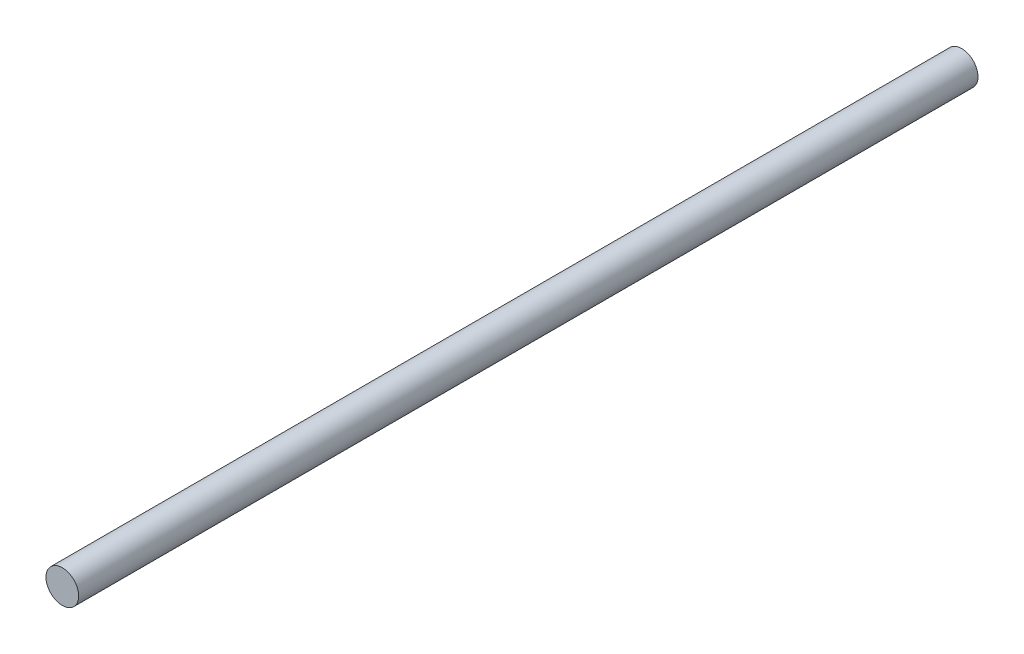
ISO-10303-21;
HEADER;
FILE_DESCRIPTION(('STEP AP214'),'2;1');
FILE_NAME('part.step','',(''),(''),'','','');
FILE_SCHEMA(('AUTOMOTIVE_DESIGN { 1 0 10303 214 1 1 1 1 }'));
ENDSEC;
DATA;
#1=APPLICATION_CONTEXT('core data for automotive mechanical design processes');
#2=APPLICATION_PROTOCOL_DEFINITION('international standard','automotive_design',2000,#1);
#3=PRODUCT_CONTEXT('',#1,'mechanical');
#4=PRODUCT('Part','Part','',(#3));
#5=PRODUCT_RELATED_PRODUCT_CATEGORY('part','',(#4));
#6=PRODUCT_DEFINITION_FORMATION('','',#4);
#7=PRODUCT_DEFINITION_CONTEXT('part definition',#1,'design');
#8=PRODUCT_DEFINITION('design','',#6,#7);
#9=PRODUCT_DEFINITION_SHAPE('','',#8);
#10=(LENGTH_UNIT() NAMED_UNIT(*) SI_UNIT(.MILLI.,.METRE.));
#11=(NAMED_UNIT(*) PLANE_ANGLE_UNIT() SI_UNIT($,.RADIAN.));
#12=(NAMED_UNIT(*) SI_UNIT($,.STERADIAN.) SOLID_ANGLE_UNIT());
#13=UNCERTAINTY_MEASURE_WITH_UNIT(LENGTH_MEASURE(1.E-05),#10,'distance_accuracy_value','');
#14=(GEOMETRIC_REPRESENTATION_CONTEXT(3) GLOBAL_UNCERTAINTY_ASSIGNED_CONTEXT((#13)) GLOBAL_UNIT_ASSIGNED_CONTEXT((#10,
#11,#12)) REPRESENTATION_CONTEXT('',''));
#15=CARTESIAN_POINT('',(0.,0.,0.));
#16=DIRECTION('',(0.,0.,1.));
#17=DIRECTION('',(1.,0.,0.));
#18=AXIS2_PLACEMENT_3D('',#15,#16,#17);
#19=CARTESIAN_POINT('',(0.,0.,220.));
#20=DIRECTION('',(0.,0.,-1.));
#21=DIRECTION('',(-1.,0.,0.));
#22=AXIS2_PLACEMENT_3D('',#19,#20,#21);
#23=CYLINDRICAL_SURFACE('',#22,4.);
#24=CARTESIAN_POINT('',(0.,0.,220.));
#25=DIRECTION('',(0.,0.,1.));
#26=DIRECTION('',(1.,0.,0.));
#27=AXIS2_PLACEMENT_3D('',#24,#25,#26);
#28=CIRCLE('',#27,4.);
#29=CARTESIAN_POINT('',(4.,0.,220.));
#30=VERTEX_POINT('',#29);
#31=EDGE_CURVE('E10',#30,#30,#28,.T.);
#32=ORIENTED_EDGE('',*,*,#31,.F.);
#33=EDGE_LOOP('',(#32));
#34=FACE_BOUND('',#33,.T.);
#35=CARTESIAN_POINT('',(0.,0.,0.));
#36=DIRECTION('',(0.,0.,1.));
#37=DIRECTION('',(1.,0.,0.));
#38=AXIS2_PLACEMENT_3D('',#35,#36,#37);
#39=CIRCLE('',#38,4.);
#40=CARTESIAN_POINT('',(4.,0.,0.));
#41=VERTEX_POINT('',#40);
#42=EDGE_CURVE('E40',#41,#41,#39,.T.);
#43=ORIENTED_EDGE('',*,*,#42,.T.);
#44=EDGE_LOOP('',(#43));
#45=FACE_BOUND('',#44,.T.);
#46=ADVANCED_FACE('F37',(#34,#45),#23,.T.);
#47=CARTESIAN_POINT('',(0.,0.,220.));
#48=DIRECTION('',(0.,0.,1.));
#49=DIRECTION('',(1.,0.,0.));
#50=AXIS2_PLACEMENT_3D('',#47,#48,#49);
#51=PLANE('',#50);
#52=ORIENTED_EDGE('',*,*,#31,.T.);
#53=EDGE_LOOP('',(#52));
#54=FACE_BOUND('',#53,.T.);
#55=ADVANCED_FACE('F52',(#54),#51,.T.);
#56=CARTESIAN_POINT('',(0.,0.,0.));
#57=DIRECTION('',(0.,0.,1.));
#58=DIRECTION('',(1.,0.,0.));
#59=AXIS2_PLACEMENT_3D('',#56,#57,#58);
#60=PLANE('',#59);
#61=ORIENTED_EDGE('',*,*,#42,.F.);
#62=EDGE_LOOP('',(#61));
#63=FACE_BOUND('',#62,.T.);
#64=ADVANCED_FACE('F50',(#63),#60,.F.);
#65=CLOSED_SHELL('',(#46,#55,#64));
#66=MANIFOLD_SOLID_BREP('B2',#65);
#67=ADVANCED_BREP_SHAPE_REPRESENTATION('',(#18,#66),#14);
#68=SHAPE_DEFINITION_REPRESENTATION(#9,#67);
ENDSEC;
END-ISO-10303-21;
